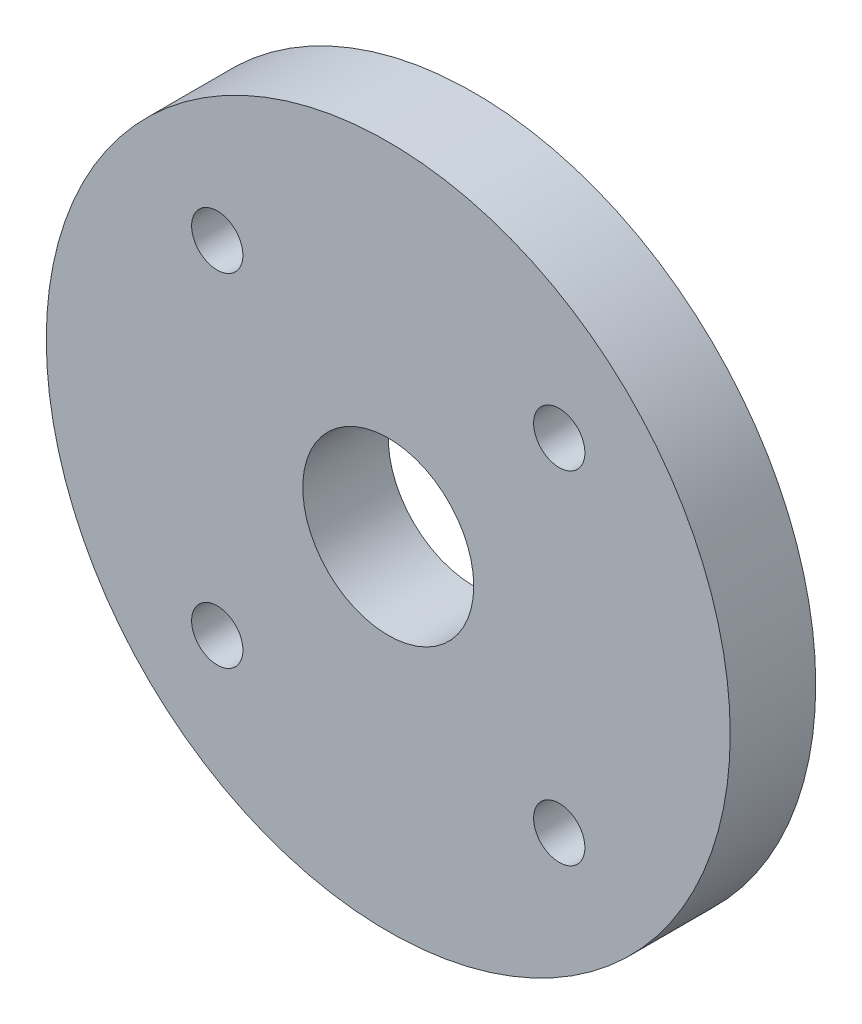
ISO-10303-21;
HEADER;
FILE_DESCRIPTION(('STEP AP214'),'2;1');
FILE_NAME('part.step','',(''),(''),'','','');
FILE_SCHEMA(('AUTOMOTIVE_DESIGN { 1 0 10303 214 1 1 1 1 }'));
ENDSEC;
DATA;
#1=APPLICATION_CONTEXT('core data for automotive mechanical design processes');
#2=APPLICATION_PROTOCOL_DEFINITION('international standard','automotive_design',2000,#1);
#3=PRODUCT_CONTEXT('',#1,'mechanical');
#4=PRODUCT('Part','Part','',(#3));
#5=PRODUCT_RELATED_PRODUCT_CATEGORY('part','',(#4));
#6=PRODUCT_DEFINITION_FORMATION('','',#4);
#7=PRODUCT_DEFINITION_CONTEXT('part definition',#1,'design');
#8=PRODUCT_DEFINITION('design','',#6,#7);
#9=PRODUCT_DEFINITION_SHAPE('','',#8);
#10=(LENGTH_UNIT() NAMED_UNIT(*) SI_UNIT(.MILLI.,.METRE.));
#11=(NAMED_UNIT(*) PLANE_ANGLE_UNIT() SI_UNIT($,.RADIAN.));
#12=(NAMED_UNIT(*) SI_UNIT($,.STERADIAN.) SOLID_ANGLE_UNIT());
#13=UNCERTAINTY_MEASURE_WITH_UNIT(LENGTH_MEASURE(1.E-05),#10,'distance_accuracy_value','');
#14=(GEOMETRIC_REPRESENTATION_CONTEXT(3) GLOBAL_UNCERTAINTY_ASSIGNED_CONTEXT((#13)) GLOBAL_UNIT_ASSIGNED_CONTEXT((#10,
#11,#12)) REPRESENTATION_CONTEXT('',''));
#15=CARTESIAN_POINT('',(0.,0.,0.));
#16=DIRECTION('',(0.,0.,1.));
#17=DIRECTION('',(1.,0.,0.));
#18=AXIS2_PLACEMENT_3D('',#15,#16,#17);
#19=CARTESIAN_POINT('',(0.,0.,5.));
#20=DIRECTION('',(0.,0.,1.));
#21=DIRECTION('',(1.,0.,0.));
#22=AXIS2_PLACEMENT_3D('',#19,#20,#21);
#23=PLANE('',#22);
#24=CARTESIAN_POINT('',(10.,10.,5.));
#25=DIRECTION('',(0.,0.,1.));
#26=DIRECTION('',(1.,0.,0.));
#27=AXIS2_PLACEMENT_3D('',#24,#25,#26);
#28=CIRCLE('',#27,1.5);
#29=CARTESIAN_POINT('',(11.5,10.,5.));
#30=VERTEX_POINT('',#29);
#31=EDGE_CURVE('E58',#30,#30,#28,.T.);
#32=ORIENTED_EDGE('',*,*,#31,.F.);
#33=EDGE_LOOP('',(#32));
#34=FACE_BOUND('',#33,.T.);
#35=CARTESIAN_POINT('',(-10.,-10.,5.));
#36=DIRECTION('',(0.,0.,1.));
#37=DIRECTION('',(1.,0.,0.));
#38=AXIS2_PLACEMENT_3D('',#35,#36,#37);
#39=CIRCLE('',#38,1.5);
#40=CARTESIAN_POINT('',(-8.5,-10.,5.));
#41=VERTEX_POINT('',#40);
#42=EDGE_CURVE('E46',#41,#41,#39,.T.);
#43=ORIENTED_EDGE('',*,*,#42,.F.);
#44=EDGE_LOOP('',(#43));
#45=FACE_BOUND('',#44,.T.);
#46=CARTESIAN_POINT('',(0.,0.,5.));
#47=DIRECTION('',(0.,0.,1.));
#48=DIRECTION('',(1.,0.,0.));
#49=AXIS2_PLACEMENT_3D('',#46,#47,#48);
#50=CIRCLE('',#49,20.);
#51=CARTESIAN_POINT('',(20.,0.,5.));
#52=VERTEX_POINT('',#51);
#53=EDGE_CURVE('E10',#52,#52,#50,.T.);
#54=ORIENTED_EDGE('',*,*,#53,.T.);
#55=EDGE_LOOP('',(#54));
#56=FACE_BOUND('',#55,.T.);
#57=CARTESIAN_POINT('',(0.,0.,5.));
#58=DIRECTION('',(0.,0.,1.));
#59=DIRECTION('',(1.,0.,0.));
#60=AXIS2_PLACEMENT_3D('',#57,#58,#59);
#61=CIRCLE('',#60,5.);
#62=CARTESIAN_POINT('',(5.,0.,5.));
#63=VERTEX_POINT('',#62);
#64=EDGE_CURVE('E41',#63,#63,#61,.T.);
#65=ORIENTED_EDGE('',*,*,#64,.F.);
#66=EDGE_LOOP('',(#65));
#67=FACE_BOUND('',#66,.T.);
#68=CARTESIAN_POINT('',(-10.,10.,5.));
#69=DIRECTION('',(0.,0.,1.));
#70=DIRECTION('',(-1.,0.,0.));
#71=AXIS2_PLACEMENT_3D('',#68,#69,#70);
#72=CIRCLE('',#71,1.5);
#73=CARTESIAN_POINT('',(-11.5,10.,5.));
#74=VERTEX_POINT('',#73);
#75=EDGE_CURVE('E52',#74,#74,#72,.T.);
#76=ORIENTED_EDGE('',*,*,#75,.F.);
#77=EDGE_LOOP('',(#76));
#78=FACE_BOUND('',#77,.T.);
#79=CARTESIAN_POINT('',(10.,-10.,5.));
#80=DIRECTION('',(0.,0.,1.));
#81=DIRECTION('',(-1.,0.,0.));
#82=AXIS2_PLACEMENT_3D('',#79,#80,#81);
#83=CIRCLE('',#82,1.5);
#84=CARTESIAN_POINT('',(8.5,-10.,5.));
#85=VERTEX_POINT('',#84);
#86=EDGE_CURVE('E64',#85,#85,#83,.T.);
#87=ORIENTED_EDGE('',*,*,#86,.F.);
#88=EDGE_LOOP('',(#87));
#89=FACE_BOUND('',#88,.T.);
#90=ADVANCED_FACE('F30',(#34,#45,#56,#67,#78,#89),#23,.T.);
#91=CARTESIAN_POINT('',(0.,0.,0.));
#92=DIRECTION('',(0.,0.,1.));
#93=DIRECTION('',(1.,0.,0.));
#94=AXIS2_PLACEMENT_3D('',#91,#92,#93);
#95=PLANE('',#94);
#96=CARTESIAN_POINT('',(10.,10.,0.));
#97=DIRECTION('',(0.,0.,1.));
#98=DIRECTION('',(1.,0.,0.));
#99=AXIS2_PLACEMENT_3D('',#96,#97,#98);
#100=CIRCLE('',#99,1.5);
#101=CARTESIAN_POINT('',(11.5,10.,0.));
#102=VERTEX_POINT('',#101);
#103=EDGE_CURVE('E61',#102,#102,#100,.T.);
#104=ORIENTED_EDGE('',*,*,#103,.T.);
#105=EDGE_LOOP('',(#104));
#106=FACE_BOUND('',#105,.T.);
#107=CARTESIAN_POINT('',(-10.,-10.,0.));
#108=DIRECTION('',(0.,0.,1.));
#109=DIRECTION('',(1.,0.,0.));
#110=AXIS2_PLACEMENT_3D('',#107,#108,#109);
#111=CIRCLE('',#110,1.5);
#112=CARTESIAN_POINT('',(-8.5,-10.,0.));
#113=VERTEX_POINT('',#112);
#114=EDGE_CURVE('E49',#113,#113,#111,.T.);
#115=ORIENTED_EDGE('',*,*,#114,.T.);
#116=EDGE_LOOP('',(#115));
#117=FACE_BOUND('',#116,.T.);
#118=CARTESIAN_POINT('',(0.,0.,0.));
#119=DIRECTION('',(0.,0.,1.));
#120=DIRECTION('',(1.,0.,0.));
#121=AXIS2_PLACEMENT_3D('',#118,#119,#120);
#122=CIRCLE('',#121,20.);
#123=CARTESIAN_POINT('',(20.,0.,0.));
#124=VERTEX_POINT('',#123);
#125=EDGE_CURVE('E34',#124,#124,#122,.T.);
#126=ORIENTED_EDGE('',*,*,#125,.F.);
#127=EDGE_LOOP('',(#126));
#128=FACE_BOUND('',#127,.T.);
#129=CARTESIAN_POINT('',(0.,0.,0.));
#130=DIRECTION('',(0.,0.,1.));
#131=DIRECTION('',(1.,0.,0.));
#132=AXIS2_PLACEMENT_3D('',#129,#130,#131);
#133=CIRCLE('',#132,5.);
#134=CARTESIAN_POINT('',(5.,0.,0.));
#135=VERTEX_POINT('',#134);
#136=EDGE_CURVE('E43',#135,#135,#133,.T.);
#137=ORIENTED_EDGE('',*,*,#136,.T.);
#138=EDGE_LOOP('',(#137));
#139=FACE_BOUND('',#138,.T.);
#140=CARTESIAN_POINT('',(-10.,10.,0.));
#141=DIRECTION('',(0.,0.,1.));
#142=DIRECTION('',(-1.,0.,0.));
#143=AXIS2_PLACEMENT_3D('',#140,#141,#142);
#144=CIRCLE('',#143,1.5);
#145=CARTESIAN_POINT('',(-11.5,10.,0.));
#146=VERTEX_POINT('',#145);
#147=EDGE_CURVE('E55',#146,#146,#144,.T.);
#148=ORIENTED_EDGE('',*,*,#147,.T.);
#149=EDGE_LOOP('',(#148));
#150=FACE_BOUND('',#149,.T.);
#151=CARTESIAN_POINT('',(10.,-10.,0.));
#152=DIRECTION('',(0.,0.,1.));
#153=DIRECTION('',(-1.,0.,0.));
#154=AXIS2_PLACEMENT_3D('',#151,#152,#153);
#155=CIRCLE('',#154,1.5);
#156=CARTESIAN_POINT('',(8.5,-10.,0.));
#157=VERTEX_POINT('',#156);
#158=EDGE_CURVE('E67',#157,#157,#155,.T.);
#159=ORIENTED_EDGE('',*,*,#158,.T.);
#160=EDGE_LOOP('',(#159));
#161=FACE_BOUND('',#160,.T.);
#162=ADVANCED_FACE('F77',(#106,#117,#128,#139,#150,#161),#95,.F.);
#163=CARTESIAN_POINT('',(0.,0.,5.));
#164=DIRECTION('',(0.,0.,-1.));
#165=DIRECTION('',(-1.,0.,0.));
#166=AXIS2_PLACEMENT_3D('',#163,#164,#165);
#167=CYLINDRICAL_SURFACE('',#166,20.);
#168=ORIENTED_EDGE('',*,*,#53,.F.);
#169=EDGE_LOOP('',(#168));
#170=FACE_BOUND('',#169,.T.);
#171=ORIENTED_EDGE('',*,*,#125,.T.);
#172=EDGE_LOOP('',(#171));
#173=FACE_BOUND('',#172,.T.);
#174=ADVANCED_FACE('F32',(#170,#173),#167,.T.);
#175=CARTESIAN_POINT('',(0.,0.,5.));
#176=DIRECTION('',(0.,0.,-1.));
#177=DIRECTION('',(-1.,0.,0.));
#178=AXIS2_PLACEMENT_3D('',#175,#176,#177);
#179=CYLINDRICAL_SURFACE('',#178,5.);
#180=ORIENTED_EDGE('',*,*,#64,.T.);
#181=EDGE_LOOP('',(#180));
#182=FACE_BOUND('',#181,.T.);
#183=ORIENTED_EDGE('',*,*,#136,.F.);
#184=EDGE_LOOP('',(#183));
#185=FACE_BOUND('',#184,.T.);
#186=ADVANCED_FACE('F87',(#182,#185),#179,.F.);
#187=CARTESIAN_POINT('',(-10.,-10.,5.));
#188=DIRECTION('',(0.,0.,-1.));
#189=DIRECTION('',(-1.,0.,0.));
#190=AXIS2_PLACEMENT_3D('',#187,#188,#189);
#191=CYLINDRICAL_SURFACE('',#190,1.5);
#192=ORIENTED_EDGE('',*,*,#42,.T.);
#193=EDGE_LOOP('',(#192));
#194=FACE_BOUND('',#193,.T.);
#195=ORIENTED_EDGE('',*,*,#114,.F.);
#196=EDGE_LOOP('',(#195));
#197=FACE_BOUND('',#196,.T.);
#198=ADVANCED_FACE('F90',(#194,#197),#191,.F.);
#199=CARTESIAN_POINT('',(-10.,10.,5.));
#200=DIRECTION('',(0.,0.,-1.));
#201=DIRECTION('',(-1.,0.,0.));
#202=AXIS2_PLACEMENT_3D('',#199,#200,#201);
#203=CYLINDRICAL_SURFACE('',#202,1.5);
#204=ORIENTED_EDGE('',*,*,#75,.T.);
#205=EDGE_LOOP('',(#204));
#206=FACE_BOUND('',#205,.T.);
#207=ORIENTED_EDGE('',*,*,#147,.F.);
#208=EDGE_LOOP('',(#207));
#209=FACE_BOUND('',#208,.T.);
#210=ADVANCED_FACE('F94',(#206,#209),#203,.F.);
#211=CARTESIAN_POINT('',(10.,10.,5.));
#212=DIRECTION('',(0.,0.,-1.));
#213=DIRECTION('',(-1.,0.,0.));
#214=AXIS2_PLACEMENT_3D('',#211,#212,#213);
#215=CYLINDRICAL_SURFACE('',#214,1.5);
#216=ORIENTED_EDGE('',*,*,#31,.T.);
#217=EDGE_LOOP('',(#216));
#218=FACE_BOUND('',#217,.T.);
#219=ORIENTED_EDGE('',*,*,#103,.F.);
#220=EDGE_LOOP('',(#219));
#221=FACE_BOUND('',#220,.T.);
#222=ADVANCED_FACE('F98',(#218,#221),#215,.F.);
#223=CARTESIAN_POINT('',(10.,-10.,5.));
#224=DIRECTION('',(0.,0.,-1.));
#225=DIRECTION('',(-1.,0.,0.));
#226=AXIS2_PLACEMENT_3D('',#223,#224,#225);
#227=CYLINDRICAL_SURFACE('',#226,1.5);
#228=ORIENTED_EDGE('',*,*,#86,.T.);
#229=EDGE_LOOP('',(#228));
#230=FACE_BOUND('',#229,.T.);
#231=ORIENTED_EDGE('',*,*,#158,.F.);
#232=EDGE_LOOP('',(#231));
#233=FACE_BOUND('',#232,.T.);
#234=ADVANCED_FACE('F73',(#230,#233),#227,.F.);
#235=CLOSED_SHELL('',(#90,#162,#174,#186,#198,#210,#222,#234));
#236=MANIFOLD_SOLID_BREP('B2',#235);
#237=ADVANCED_BREP_SHAPE_REPRESENTATION('',(#18,#236),#14);
#238=SHAPE_DEFINITION_REPRESENTATION(#9,#237);
ENDSEC;
END-ISO-10303-21;
